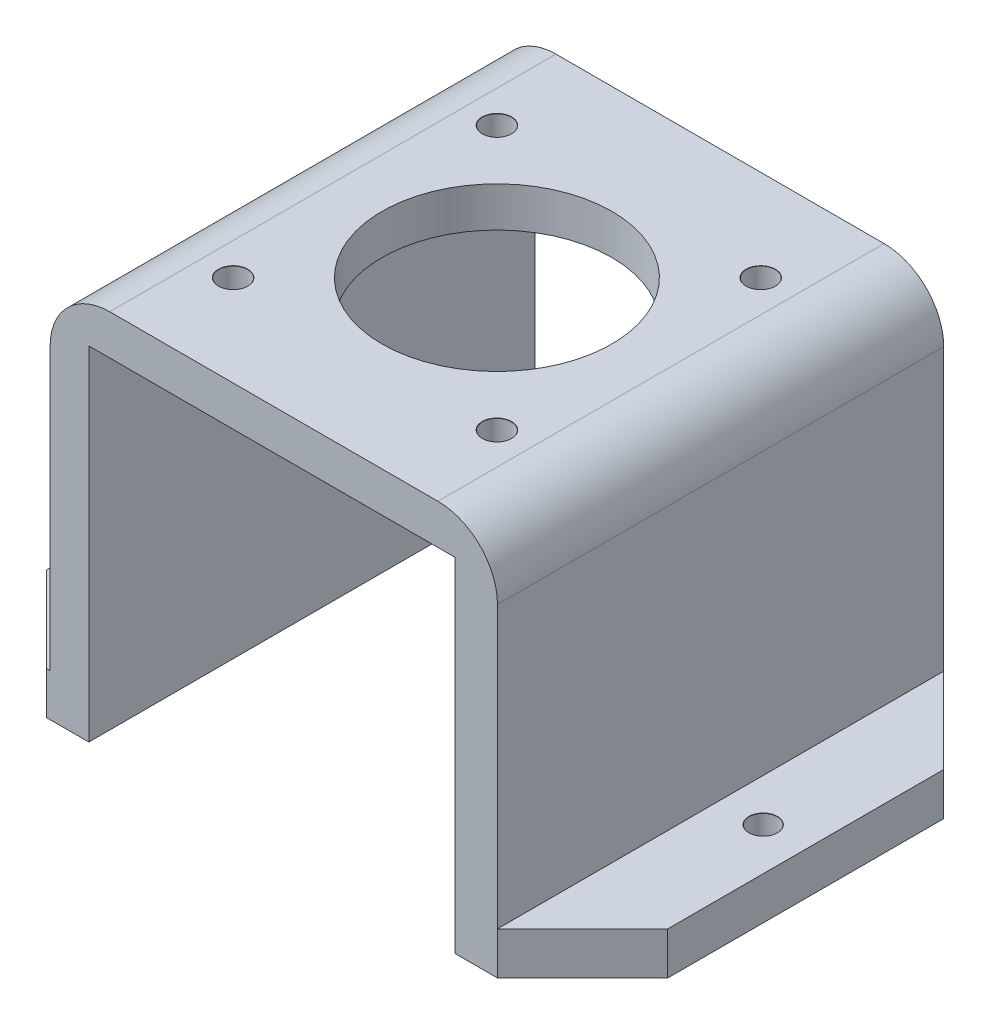
ISO-10303-21;
HEADER;
FILE_DESCRIPTION(('STEP AP214'),'2;1');
FILE_NAME('part.step','',(''),(''),'','','');
FILE_SCHEMA(('AUTOMOTIVE_DESIGN { 1 0 10303 214 1 1 1 1 }'));
ENDSEC;
DATA;
#1=APPLICATION_CONTEXT('core data for automotive mechanical design processes');
#2=APPLICATION_PROTOCOL_DEFINITION('international standard','automotive_design',2000,#1);
#3=PRODUCT_CONTEXT('',#1,'mechanical');
#4=PRODUCT('Part','Part','',(#3));
#5=PRODUCT_RELATED_PRODUCT_CATEGORY('part','',(#4));
#6=PRODUCT_DEFINITION_FORMATION('','',#4);
#7=PRODUCT_DEFINITION_CONTEXT('part definition',#1,'design');
#8=PRODUCT_DEFINITION('design','',#6,#7);
#9=PRODUCT_DEFINITION_SHAPE('','',#8);
#10=(LENGTH_UNIT() NAMED_UNIT(*) SI_UNIT(.MILLI.,.METRE.));
#11=(NAMED_UNIT(*) PLANE_ANGLE_UNIT() SI_UNIT($,.RADIAN.));
#12=(NAMED_UNIT(*) SI_UNIT($,.STERADIAN.) SOLID_ANGLE_UNIT());
#13=UNCERTAINTY_MEASURE_WITH_UNIT(LENGTH_MEASURE(1.E-05),#10,'distance_accuracy_value','');
#14=(GEOMETRIC_REPRESENTATION_CONTEXT(3) GLOBAL_UNCERTAINTY_ASSIGNED_CONTEXT((#13)) GLOBAL_UNIT_ASSIGNED_CONTEXT((#10,
#11,#12)) REPRESENTATION_CONTEXT('',''));
#15=CARTESIAN_POINT('',(0.,0.,0.));
#16=DIRECTION('',(0.,0.,1.));
#17=DIRECTION('',(1.,0.,0.));
#18=AXIS2_PLACEMENT_3D('',#15,#16,#17);
#19=CARTESIAN_POINT('',(15.,45.,0.));
#20=DIRECTION('',(-1.,0.,0.));
#21=DIRECTION('',(0.,0.,1.));
#22=AXIS2_PLACEMENT_3D('',#19,#20,#21);
#23=PLANE('',#22);
#24=DIRECTION('',(0.,0.,-1.));
#25=VECTOR('',#24,1.);
#26=CARTESIAN_POINT('',(15.,0.,0.));
#27=LINE('',#26,#25);
#28=CARTESIAN_POINT('',(15.,0.,-10.));
#29=VERTEX_POINT('',#28);
#30=CARTESIAN_POINT('',(15.,0.,-42.4179999999999));
#31=VERTEX_POINT('',#30);
#32=EDGE_CURVE('E232',#29,#31,#27,.T.);
#33=ORIENTED_EDGE('',*,*,#32,.T.);
#34=DIRECTION('',(0.,1.,0.));
#35=VECTOR('',#34,1.);
#36=CARTESIAN_POINT('',(15.,5.,-42.4179999999999));
#37=LINE('',#36,#35);
#38=CARTESIAN_POINT('',(15.,5.,-42.4179999999999));
#39=VERTEX_POINT('',#38);
#40=EDGE_CURVE('E292',#31,#39,#37,.T.);
#41=ORIENTED_EDGE('',*,*,#40,.T.);
#42=DIRECTION('',(0.,0.,1.));
#43=VECTOR('',#42,1.);
#44=CARTESIAN_POINT('',(15.,5.,0.));
#45=LINE('',#44,#43);
#46=CARTESIAN_POINT('',(15.,5.,-10.));
#47=VERTEX_POINT('',#46);
#48=EDGE_CURVE('E211',#39,#47,#45,.T.);
#49=ORIENTED_EDGE('',*,*,#48,.T.);
#50=DIRECTION('',(0.,-1.,0.));
#51=VECTOR('',#50,1.);
#52=CARTESIAN_POINT('',(15.,45.,-10.));
#53=LINE('',#52,#51);
#54=EDGE_CURVE('E289',#47,#29,#53,.T.);
#55=ORIENTED_EDGE('',*,*,#54,.T.);
#56=EDGE_LOOP('',(#33,#41,#49,#55));
#57=FACE_BOUND('',#56,.T.);
#58=ADVANCED_FACE('F40',(#57),#23,.F.);
#59=CARTESIAN_POINT('',(0.,45.,0.));
#60=DIRECTION('',(0.,0.,-1.));
#61=DIRECTION('',(-1.,0.,0.));
#62=AXIS2_PLACEMENT_3D('',#59,#60,#61);
#63=PLANE('',#62);
#64=DIRECTION('',(0.,1.,0.));
#65=VECTOR('',#64,1.);
#66=CARTESIAN_POINT('',(5.,5.,0.));
#67=LINE('',#66,#65);
#68=CARTESIAN_POINT('',(5.,5.,0.));
#69=VERTEX_POINT('',#68);
#70=CARTESIAN_POINT('',(5.,38.,0.));
#71=VERTEX_POINT('',#70);
#72=EDGE_CURVE('E218',#69,#71,#67,.T.);
#73=ORIENTED_EDGE('',*,*,#72,.T.);
#74=CARTESIAN_POINT('',(-2.,38.,0.));
#75=DIRECTION('',(0.,0.,-1.));
#76=DIRECTION('',(-1.,0.,0.));
#77=AXIS2_PLACEMENT_3D('',#74,#75,#76);
#78=CIRCLE('',#77,7.);
#79=CARTESIAN_POINT('',(-2.,45.,0.));
#80=VERTEX_POINT('',#79);
#81=EDGE_CURVE('E308',#71,#80,#78,.F.);
#82=ORIENTED_EDGE('',*,*,#81,.T.);
#83=DIRECTION('',(1.,0.,0.));
#84=VECTOR('',#83,1.);
#85=CARTESIAN_POINT('',(0.,45.,0.));
#86=LINE('',#85,#84);
#87=CARTESIAN_POINT('',(-40.5483696377772,45.,0.));
#88=VERTEX_POINT('',#87);
#89=EDGE_CURVE('E224',#88,#80,#86,.T.);
#90=ORIENTED_EDGE('',*,*,#89,.F.);
#91=CARTESIAN_POINT('',(-40.5483696377772,38.,0.));
#92=DIRECTION('',(0.,0.,-1.));
#93=DIRECTION('',(-1.,0.,0.));
#94=AXIS2_PLACEMENT_3D('',#91,#92,#93);
#95=CIRCLE('',#94,7.);
#96=CARTESIAN_POINT('',(-47.5483696377772,38.,0.));
#97=VERTEX_POINT('',#96);
#98=EDGE_CURVE('E306',#88,#97,#95,.F.);
#99=ORIENTED_EDGE('',*,*,#98,.T.);
#100=DIRECTION('',(0.,1.,0.));
#101=VECTOR('',#100,1.);
#102=CARTESIAN_POINT('',(-47.5483696377772,5.,0.));
#103=LINE('',#102,#101);
#104=CARTESIAN_POINT('',(-47.5483696377772,5.,0.));
#105=VERTEX_POINT('',#104);
#106=EDGE_CURVE('E166',#105,#97,#103,.T.);
#107=ORIENTED_EDGE('',*,*,#106,.F.);
#108=DIRECTION('',(1.,0.,0.));
#109=VECTOR('',#108,1.);
#110=CARTESIAN_POINT('',(0.,5.,0.));
#111=LINE('',#110,#109);
#112=CARTESIAN_POINT('',(-48.,5.,0.));
#113=VERTEX_POINT('',#112);
#114=EDGE_CURVE('E167',#113,#105,#111,.T.);
#115=ORIENTED_EDGE('',*,*,#114,.F.);
#116=DIRECTION('',(0.,-1.,0.));
#117=VECTOR('',#116,1.);
#118=CARTESIAN_POINT('',(-48.,45.,0.));
#119=LINE('',#118,#117);
#120=CARTESIAN_POINT('',(-48.,0.,0.));
#121=VERTEX_POINT('',#120);
#122=EDGE_CURVE('E298',#113,#121,#119,.T.);
#123=ORIENTED_EDGE('',*,*,#122,.T.);
#124=DIRECTION('',(-1.,0.,0.));
#125=VECTOR('',#124,1.);
#126=CARTESIAN_POINT('',(-43.,0.,0.));
#127=LINE('',#126,#125);
#128=CARTESIAN_POINT('',(-43.,0.,0.));
#129=VERTEX_POINT('',#128);
#130=EDGE_CURVE('E201',#129,#121,#127,.T.);
#131=ORIENTED_EDGE('',*,*,#130,.F.);
#132=DIRECTION('',(0.,-1.,0.));
#133=VECTOR('',#132,1.);
#134=CARTESIAN_POINT('',(-43.,45.,0.));
#135=LINE('',#134,#133);
#136=CARTESIAN_POINT('',(-43.,40.3,0.));
#137=VERTEX_POINT('',#136);
#138=EDGE_CURVE('E188',#137,#129,#135,.T.);
#139=ORIENTED_EDGE('',*,*,#138,.F.);
#140=DIRECTION('',(1.,0.,0.));
#141=VECTOR('',#140,1.);
#142=CARTESIAN_POINT('',(-44.,40.3,0.));
#143=LINE('',#142,#141);
#144=CARTESIAN_POINT('',(0.,40.3,0.));
#145=VERTEX_POINT('',#144);
#146=EDGE_CURVE('E207',#137,#145,#143,.T.);
#147=ORIENTED_EDGE('',*,*,#146,.T.);
#148=DIRECTION('',(0.,-1.,0.));
#149=VECTOR('',#148,1.);
#150=CARTESIAN_POINT('',(0.,45.,0.));
#151=LINE('',#150,#149);
#152=CARTESIAN_POINT('',(0.,0.,0.));
#153=VERTEX_POINT('',#152);
#154=EDGE_CURVE('E229',#145,#153,#151,.T.);
#155=ORIENTED_EDGE('',*,*,#154,.T.);
#156=DIRECTION('',(1.,0.,0.));
#157=VECTOR('',#156,1.);
#158=CARTESIAN_POINT('',(0.,0.,0.));
#159=LINE('',#158,#157);
#160=CARTESIAN_POINT('',(4.99999999999997,0.,0.));
#161=VERTEX_POINT('',#160);
#162=EDGE_CURVE('E221',#153,#161,#159,.T.);
#163=ORIENTED_EDGE('',*,*,#162,.T.);
#164=DIRECTION('',(0.,1.,0.));
#165=VECTOR('',#164,1.);
#166=CARTESIAN_POINT('',(4.99999999999997,45.,0.));
#167=LINE('',#166,#165);
#168=EDGE_CURVE('E301',#161,#69,#167,.T.);
#169=ORIENTED_EDGE('',*,*,#168,.T.);
#170=EDGE_LOOP('',(#73,#82,#90,#99,#107,#115,#123,#131,#139,#147,#155,#163,#169));
#171=FACE_BOUND('',#170,.T.);
#172=ADVANCED_FACE('F327',(#171),#63,.F.);
#173=CARTESIAN_POINT('',(0.,45.,-52.418));
#174=DIRECTION('',(0.,0.,-1.));
#175=DIRECTION('',(-1.,0.,0.));
#176=AXIS2_PLACEMENT_3D('',#173,#174,#175);
#177=PLANE('',#176);
#178=DIRECTION('',(1.,0.,0.));
#179=VECTOR('',#178,1.);
#180=CARTESIAN_POINT('',(0.,45.,-52.418));
#181=LINE('',#180,#179);
#182=CARTESIAN_POINT('',(-40.5483696377772,45.,-52.418));
#183=VERTEX_POINT('',#182);
#184=CARTESIAN_POINT('',(-2.,45.,-52.418));
#185=VERTEX_POINT('',#184);
#186=EDGE_CURVE('E226',#183,#185,#181,.T.);
#187=ORIENTED_EDGE('',*,*,#186,.T.);
#188=CARTESIAN_POINT('',(-2.,38.,-52.418));
#189=DIRECTION('',(0.,0.,-1.));
#190=DIRECTION('',(-1.,0.,0.));
#191=AXIS2_PLACEMENT_3D('',#188,#189,#190);
#192=CIRCLE('',#191,7.);
#193=CARTESIAN_POINT('',(5.,38.,-52.418));
#194=VERTEX_POINT('',#193);
#195=EDGE_CURVE('E48',#185,#194,#192,.T.);
#196=ORIENTED_EDGE('',*,*,#195,.T.);
#197=DIRECTION('',(0.,1.,0.));
#198=VECTOR('',#197,1.);
#199=CARTESIAN_POINT('',(5.,5.,-52.418));
#200=LINE('',#199,#198);
#201=CARTESIAN_POINT('',(5.,5.,-52.418));
#202=VERTEX_POINT('',#201);
#203=EDGE_CURVE('E217',#202,#194,#200,.T.);
#204=ORIENTED_EDGE('',*,*,#203,.F.);
#205=DIRECTION('',(0.,-1.,0.));
#206=VECTOR('',#205,1.);
#207=CARTESIAN_POINT('',(4.99999999999999,0.,-52.418));
#208=LINE('',#207,#206);
#209=CARTESIAN_POINT('',(4.99999999999999,0.,-52.418));
#210=VERTEX_POINT('',#209);
#211=EDGE_CURVE('E277',#202,#210,#208,.T.);
#212=ORIENTED_EDGE('',*,*,#211,.T.);
#213=DIRECTION('',(1.,0.,0.));
#214=VECTOR('',#213,1.);
#215=CARTESIAN_POINT('',(0.,0.,-52.418));
#216=LINE('',#215,#214);
#217=CARTESIAN_POINT('',(0.,0.,-52.418));
#218=VERTEX_POINT('',#217);
#219=EDGE_CURVE('E235',#218,#210,#216,.T.);
#220=ORIENTED_EDGE('',*,*,#219,.F.);
#221=DIRECTION('',(0.,-1.,0.));
#222=VECTOR('',#221,1.);
#223=CARTESIAN_POINT('',(0.,45.,-52.418));
#224=LINE('',#223,#222);
#225=CARTESIAN_POINT('',(0.,40.3,-52.418));
#226=VERTEX_POINT('',#225);
#227=EDGE_CURVE('E241',#226,#218,#224,.T.);
#228=ORIENTED_EDGE('',*,*,#227,.F.);
#229=DIRECTION('',(1.,0.,0.));
#230=VECTOR('',#229,1.);
#231=CARTESIAN_POINT('',(-44.,40.3,-52.418));
#232=LINE('',#231,#230);
#233=CARTESIAN_POINT('',(-43.,40.3,-52.418));
#234=VERTEX_POINT('',#233);
#235=EDGE_CURVE('E209',#234,#226,#232,.T.);
#236=ORIENTED_EDGE('',*,*,#235,.F.);
#237=DIRECTION('',(0.,-1.,0.));
#238=VECTOR('',#237,1.);
#239=CARTESIAN_POINT('',(-43.,45.,-52.418));
#240=LINE('',#239,#238);
#241=CARTESIAN_POINT('',(-43.,0.,-52.418));
#242=VERTEX_POINT('',#241);
#243=EDGE_CURVE('E190',#234,#242,#240,.T.);
#244=ORIENTED_EDGE('',*,*,#243,.T.);
#245=DIRECTION('',(-1.,0.,0.));
#246=VECTOR('',#245,1.);
#247=CARTESIAN_POINT('',(-43.,0.,-52.418));
#248=LINE('',#247,#246);
#249=CARTESIAN_POINT('',(-48.,0.,-52.418));
#250=VERTEX_POINT('',#249);
#251=EDGE_CURVE('E196',#242,#250,#248,.T.);
#252=ORIENTED_EDGE('',*,*,#251,.T.);
#253=DIRECTION('',(0.,1.,0.));
#254=VECTOR('',#253,1.);
#255=CARTESIAN_POINT('',(-48.,5.,-52.418));
#256=LINE('',#255,#254);
#257=CARTESIAN_POINT('',(-48.,5.,-52.418));
#258=VERTEX_POINT('',#257);
#259=EDGE_CURVE('E180',#250,#258,#256,.T.);
#260=ORIENTED_EDGE('',*,*,#259,.T.);
#261=DIRECTION('',(-1.,0.,0.));
#262=VECTOR('',#261,1.);
#263=CARTESIAN_POINT('',(0.,5.,-52.418));
#264=LINE('',#263,#262);
#265=CARTESIAN_POINT('',(-47.5483696377772,5.,-52.418));
#266=VERTEX_POINT('',#265);
#267=EDGE_CURVE('E172',#266,#258,#264,.T.);
#268=ORIENTED_EDGE('',*,*,#267,.F.);
#269=DIRECTION('',(0.,1.,0.));
#270=VECTOR('',#269,1.);
#271=CARTESIAN_POINT('',(-47.5483696377772,5.,-52.418));
#272=LINE('',#271,#270);
#273=CARTESIAN_POINT('',(-47.5483696377772,38.,-52.418));
#274=VERTEX_POINT('',#273);
#275=EDGE_CURVE('E158',#266,#274,#272,.T.);
#276=ORIENTED_EDGE('',*,*,#275,.T.);
#277=CARTESIAN_POINT('',(-40.5483696377772,38.,-52.418));
#278=DIRECTION('',(0.,0.,-1.));
#279=DIRECTION('',(-1.,0.,0.));
#280=AXIS2_PLACEMENT_3D('',#277,#278,#279);
#281=CIRCLE('',#280,7.);
#282=EDGE_CURVE('E314',#274,#183,#281,.T.);
#283=ORIENTED_EDGE('',*,*,#282,.T.);
#284=EDGE_LOOP('',(#187,#196,#204,#212,#220,#228,#236,#244,#252,#260,#268,#276,#283));
#285=FACE_BOUND('',#284,.T.);
#286=ADVANCED_FACE('F177',(#285),#177,.T.);
#287=CARTESIAN_POINT('',(0.,45.,0.));
#288=DIRECTION('',(-1.,0.,0.));
#289=DIRECTION('',(0.,0.,1.));
#290=AXIS2_PLACEMENT_3D('',#287,#288,#289);
#291=PLANE('',#290);
#292=DIRECTION('',(0.,0.,1.));
#293=VECTOR('',#292,1.);
#294=CARTESIAN_POINT('',(0.,40.3,0.));
#295=LINE('',#294,#293);
#296=EDGE_CURVE('E204',#226,#145,#295,.T.);
#297=ORIENTED_EDGE('',*,*,#296,.F.);
#298=ORIENTED_EDGE('',*,*,#227,.T.);
#299=DIRECTION('',(0.,0.,-1.));
#300=VECTOR('',#299,1.);
#301=CARTESIAN_POINT('',(0.,0.,0.));
#302=LINE('',#301,#300);
#303=EDGE_CURVE('E227',#153,#218,#302,.T.);
#304=ORIENTED_EDGE('',*,*,#303,.F.);
#305=ORIENTED_EDGE('',*,*,#154,.F.);
#306=EDGE_LOOP('',(#297,#298,#304,#305));
#307=FACE_BOUND('',#306,.T.);
#308=ADVANCED_FACE('F361',(#307),#291,.T.);
#309=CARTESIAN_POINT('',(0.,45.,0.));
#310=DIRECTION('',(0.,1.,0.));
#311=DIRECTION('',(0.,0.,1.));
#312=AXIS2_PLACEMENT_3D('',#309,#310,#311);
#313=PLANE('',#312);
#314=CARTESIAN_POINT('',(-21.2741848188886,45.,-26.209));
#315=DIRECTION('',(0.,1.,0.));
#316=DIRECTION('',(0.,0.,1.));
#317=AXIS2_PLACEMENT_3D('',#314,#315,#316);
#318=CIRCLE('',#317,13.5);
#319=CARTESIAN_POINT('',(-21.2741848188886,45.,-12.709));
#320=VERTEX_POINT('',#319);
#321=EDGE_CURVE('E268',#320,#320,#318,.T.);
#322=ORIENTED_EDGE('',*,*,#321,.F.);
#323=EDGE_LOOP('',(#322));
#324=FACE_BOUND('',#323,.T.);
#325=CARTESIAN_POINT('',(-36.7681848188886,45.,-41.703));
#326=DIRECTION('',(0.,1.,0.));
#327=DIRECTION('',(0.,0.,1.));
#328=AXIS2_PLACEMENT_3D('',#325,#326,#327);
#329=CIRCLE('',#328,1.725);
#330=CARTESIAN_POINT('',(-36.7681848188886,45.,-39.978));
#331=VERTEX_POINT('',#330);
#332=EDGE_CURVE('E267',#331,#331,#329,.T.);
#333=ORIENTED_EDGE('',*,*,#332,.F.);
#334=EDGE_LOOP('',(#333));
#335=FACE_BOUND('',#334,.T.);
#336=CARTESIAN_POINT('',(-5.78018481888859,45.,-41.703));
#337=DIRECTION('',(0.,1.,0.));
#338=DIRECTION('',(0.,0.,1.));
#339=AXIS2_PLACEMENT_3D('',#336,#337,#338);
#340=CIRCLE('',#339,1.725);
#341=CARTESIAN_POINT('',(-5.78018481888859,45.,-39.978));
#342=VERTEX_POINT('',#341);
#343=EDGE_CURVE('E262',#342,#342,#340,.T.);
#344=ORIENTED_EDGE('',*,*,#343,.F.);
#345=EDGE_LOOP('',(#344));
#346=FACE_BOUND('',#345,.T.);
#347=CARTESIAN_POINT('',(-5.78018481888859,45.,-10.715));
#348=DIRECTION('',(0.,1.,0.));
#349=DIRECTION('',(0.,0.,1.));
#350=AXIS2_PLACEMENT_3D('',#347,#348,#349);
#351=CIRCLE('',#350,1.725);
#352=CARTESIAN_POINT('',(-5.78018481888859,45.,-8.99));
#353=VERTEX_POINT('',#352);
#354=EDGE_CURVE('E257',#353,#353,#351,.T.);
#355=ORIENTED_EDGE('',*,*,#354,.F.);
#356=EDGE_LOOP('',(#355));
#357=FACE_BOUND('',#356,.T.);
#358=CARTESIAN_POINT('',(-36.7681848188886,45.,-10.715));
#359=DIRECTION('',(0.,1.,0.));
#360=DIRECTION('',(0.,0.,1.));
#361=AXIS2_PLACEMENT_3D('',#358,#359,#360);
#362=CIRCLE('',#361,1.725);
#363=CARTESIAN_POINT('',(-36.7681848188886,45.,-8.99));
#364=VERTEX_POINT('',#363);
#365=EDGE_CURVE('E252',#364,#364,#362,.T.);
#366=ORIENTED_EDGE('',*,*,#365,.F.);
#367=EDGE_LOOP('',(#366));
#368=FACE_BOUND('',#367,.T.);
#369=ORIENTED_EDGE('',*,*,#89,.T.);
#370=DIRECTION('',(0.,0.,1.));
#371=VECTOR('',#370,1.);
#372=CARTESIAN_POINT('',(-2.,45.,-52.418));
#373=LINE('',#372,#371);
#374=EDGE_CURVE('E61',#80,#185,#373,.F.);
#375=ORIENTED_EDGE('',*,*,#374,.T.);
#376=ORIENTED_EDGE('',*,*,#186,.F.);
#377=DIRECTION('',(0.,0.,1.));
#378=VECTOR('',#377,1.);
#379=CARTESIAN_POINT('',(-40.5483696377772,45.,0.));
#380=LINE('',#379,#378);
#381=EDGE_CURVE('E310',#183,#88,#380,.T.);
#382=ORIENTED_EDGE('',*,*,#381,.T.);
#383=EDGE_LOOP('',(#369,#375,#376,#382));
#384=FACE_BOUND('',#383,.T.);
#385=ADVANCED_FACE('F328',(#324,#335,#346,#357,#368,#384),#313,.T.);
#386=CARTESIAN_POINT('',(0.,0.,0.));
#387=DIRECTION('',(0.,1.,0.));
#388=DIRECTION('',(0.,0.,1.));
#389=AXIS2_PLACEMENT_3D('',#386,#387,#388);
#390=PLANE('',#389);
#391=CARTESIAN_POINT('',(9.99999999999999,0.,-26.209));
#392=DIRECTION('',(0.,1.,0.));
#393=DIRECTION('',(0.,0.,1.));
#394=AXIS2_PLACEMENT_3D('',#391,#392,#393);
#395=CIRCLE('',#394,1.65);
#396=CARTESIAN_POINT('',(9.99999999999999,0.,-24.559));
#397=VERTEX_POINT('',#396);
#398=EDGE_CURVE('E729',#397,#397,#395,.T.);
#399=ORIENTED_EDGE('',*,*,#398,.T.);
#400=EDGE_LOOP('',(#399));
#401=FACE_BOUND('',#400,.T.);
#402=ORIENTED_EDGE('',*,*,#219,.T.);
#403=DIRECTION('',(0.707106781186546,0.,0.707106781186549));
#404=VECTOR('',#403,1.);
#405=CARTESIAN_POINT('',(4.99999999999999,0.,-52.418));
#406=LINE('',#405,#404);
#407=EDGE_CURVE('E287',#210,#31,#406,.T.);
#408=ORIENTED_EDGE('',*,*,#407,.T.);
#409=ORIENTED_EDGE('',*,*,#32,.F.);
#410=DIRECTION('',(0.707106781186549,0.,-0.707106781186546));
#411=VECTOR('',#410,1.);
#412=CARTESIAN_POINT('',(15.,0.,-10.));
#413=LINE('',#412,#411);
#414=EDGE_CURVE('E285',#29,#161,#413,.F.);
#415=ORIENTED_EDGE('',*,*,#414,.T.);
#416=ORIENTED_EDGE('',*,*,#162,.F.);
#417=ORIENTED_EDGE('',*,*,#303,.T.);
#418=EDGE_LOOP('',(#402,#408,#409,#415,#416,#417));
#419=FACE_BOUND('',#418,.T.);
#420=ADVANCED_FACE('F442',(#401,#419),#390,.F.);
#421=CARTESIAN_POINT('',(5.,5.,0.));
#422=DIRECTION('',(-1.,0.,0.));
#423=DIRECTION('',(0.,0.,1.));
#424=AXIS2_PLACEMENT_3D('',#421,#422,#423);
#425=PLANE('',#424);
#426=ORIENTED_EDGE('',*,*,#203,.T.);
#427=DIRECTION('',(0.,0.,1.));
#428=VECTOR('',#427,1.);
#429=CARTESIAN_POINT('',(5.,38.,0.));
#430=LINE('',#429,#428);
#431=EDGE_CURVE('E303',#194,#71,#430,.T.);
#432=ORIENTED_EDGE('',*,*,#431,.T.);
#433=ORIENTED_EDGE('',*,*,#72,.F.);
#434=DIRECTION('',(0.,0.,1.));
#435=VECTOR('',#434,1.);
#436=CARTESIAN_POINT('',(5.,5.,0.));
#437=LINE('',#436,#435);
#438=EDGE_CURVE('E214',#202,#69,#437,.T.);
#439=ORIENTED_EDGE('',*,*,#438,.F.);
#440=EDGE_LOOP('',(#426,#432,#433,#439));
#441=FACE_BOUND('',#440,.T.);
#442=ADVANCED_FACE('F322',(#441),#425,.F.);
#443=CARTESIAN_POINT('',(0.,5.,0.));
#444=DIRECTION('',(0.,1.,0.));
#445=DIRECTION('',(0.,0.,1.));
#446=AXIS2_PLACEMENT_3D('',#443,#444,#445);
#447=PLANE('',#446);
#448=CARTESIAN_POINT('',(9.99999999999999,5.,-26.209));
#449=DIRECTION('',(0.,1.,0.));
#450=DIRECTION('',(0.,0.,1.));
#451=AXIS2_PLACEMENT_3D('',#448,#449,#450);
#452=CIRCLE('',#451,1.675);
#453=CARTESIAN_POINT('',(9.99999999999999,5.,-24.534));
#454=VERTEX_POINT('',#453);
#455=EDGE_CURVE('E735',#454,#454,#452,.T.);
#456=ORIENTED_EDGE('',*,*,#455,.F.);
#457=EDGE_LOOP('',(#456));
#458=FACE_BOUND('',#457,.T.);
#459=ORIENTED_EDGE('',*,*,#48,.F.);
#460=DIRECTION('',(-0.707106781186546,0.,-0.707106781186549));
#461=VECTOR('',#460,1.);
#462=CARTESIAN_POINT('',(28.709,5.,-28.7089999999999));
#463=LINE('',#462,#461);
#464=EDGE_CURVE('E296',#39,#202,#463,.T.);
#465=ORIENTED_EDGE('',*,*,#464,.T.);
#466=ORIENTED_EDGE('',*,*,#438,.T.);
#467=DIRECTION('',(-0.707106781186549,0.,0.707106781186546));
#468=VECTOR('',#467,1.);
#469=CARTESIAN_POINT('',(2.49999999999998,5.,2.49999999999998));
#470=LINE('',#469,#468);
#471=EDGE_CURVE('E294',#69,#47,#470,.F.);
#472=ORIENTED_EDGE('',*,*,#471,.T.);
#473=EDGE_LOOP('',(#459,#465,#466,#472));
#474=FACE_BOUND('',#473,.T.);
#475=ADVANCED_FACE('F364',(#458,#474),#447,.T.);
#476=CARTESIAN_POINT('',(-44.,40.3,0.));
#477=DIRECTION('',(0.,1.,0.));
#478=DIRECTION('',(0.,0.,1.));
#479=AXIS2_PLACEMENT_3D('',#476,#477,#478);
#480=PLANE('',#479);
#481=CARTESIAN_POINT('',(-21.2741848188886,40.3,-26.209));
#482=DIRECTION('',(0.,1.,0.));
#483=DIRECTION('',(0.,0.,1.));
#484=AXIS2_PLACEMENT_3D('',#481,#482,#483);
#485=CIRCLE('',#484,13.5);
#486=CARTESIAN_POINT('',(-21.2741848188886,40.3,-12.709));
#487=VERTEX_POINT('',#486);
#488=EDGE_CURVE('E264',#487,#487,#485,.T.);
#489=ORIENTED_EDGE('',*,*,#488,.T.);
#490=EDGE_LOOP('',(#489));
#491=FACE_BOUND('',#490,.T.);
#492=CARTESIAN_POINT('',(-36.7681848188886,40.3,-41.703));
#493=DIRECTION('',(0.,1.,0.));
#494=DIRECTION('',(0.,0.,1.));
#495=AXIS2_PLACEMENT_3D('',#492,#493,#494);
#496=CIRCLE('',#495,1.7);
#497=CARTESIAN_POINT('',(-36.7681848188886,40.3,-40.003));
#498=VERTEX_POINT('',#497);
#499=EDGE_CURVE('E259',#498,#498,#496,.T.);
#500=ORIENTED_EDGE('',*,*,#499,.T.);
#501=EDGE_LOOP('',(#500));
#502=FACE_BOUND('',#501,.T.);
#503=CARTESIAN_POINT('',(-5.78018481888859,40.3,-41.703));
#504=DIRECTION('',(0.,1.,0.));
#505=DIRECTION('',(0.,0.,1.));
#506=AXIS2_PLACEMENT_3D('',#503,#504,#505);
#507=CIRCLE('',#506,1.7);
#508=CARTESIAN_POINT('',(-5.78018481888859,40.3,-40.003));
#509=VERTEX_POINT('',#508);
#510=EDGE_CURVE('E254',#509,#509,#507,.T.);
#511=ORIENTED_EDGE('',*,*,#510,.T.);
#512=EDGE_LOOP('',(#511));
#513=FACE_BOUND('',#512,.T.);
#514=CARTESIAN_POINT('',(-5.78018481888859,40.3,-10.715));
#515=DIRECTION('',(0.,1.,0.));
#516=DIRECTION('',(0.,0.,1.));
#517=AXIS2_PLACEMENT_3D('',#514,#515,#516);
#518=CIRCLE('',#517,1.7);
#519=CARTESIAN_POINT('',(-5.78018481888859,40.3,-9.015));
#520=VERTEX_POINT('',#519);
#521=EDGE_CURVE('E249',#520,#520,#518,.T.);
#522=ORIENTED_EDGE('',*,*,#521,.T.);
#523=EDGE_LOOP('',(#522));
#524=FACE_BOUND('',#523,.T.);
#525=CARTESIAN_POINT('',(-36.7681848188886,40.3,-10.715));
#526=DIRECTION('',(0.,1.,0.));
#527=DIRECTION('',(0.,0.,1.));
#528=AXIS2_PLACEMENT_3D('',#525,#526,#527);
#529=CIRCLE('',#528,1.7);
#530=CARTESIAN_POINT('',(-36.7681848188886,40.3,-9.015));
#531=VERTEX_POINT('',#530);
#532=EDGE_CURVE('E175',#531,#531,#529,.T.);
#533=ORIENTED_EDGE('',*,*,#532,.T.);
#534=EDGE_LOOP('',(#533));
#535=FACE_BOUND('',#534,.T.);
#536=ORIENTED_EDGE('',*,*,#146,.F.);
#537=DIRECTION('',(0.,0.,-1.));
#538=VECTOR('',#537,1.);
#539=CARTESIAN_POINT('',(-43.,40.3,0.));
#540=LINE('',#539,#538);
#541=EDGE_CURVE('E243',#137,#234,#540,.T.);
#542=ORIENTED_EDGE('',*,*,#541,.T.);
#543=ORIENTED_EDGE('',*,*,#235,.T.);
#544=ORIENTED_EDGE('',*,*,#296,.T.);
#545=EDGE_LOOP('',(#536,#542,#543,#544));
#546=FACE_BOUND('',#545,.T.);
#547=ADVANCED_FACE('F362',(#491,#502,#513,#524,#535,#546),#480,.F.);
#548=CARTESIAN_POINT('',(-43.,45.,-52.418));
#549=DIRECTION('',(1.,0.,0.));
#550=DIRECTION('',(0.,0.,-1.));
#551=AXIS2_PLACEMENT_3D('',#548,#549,#550);
#552=PLANE('',#551);
#553=ORIENTED_EDGE('',*,*,#541,.F.);
#554=ORIENTED_EDGE('',*,*,#138,.T.);
#555=DIRECTION('',(0.,0.,1.));
#556=VECTOR('',#555,1.);
#557=CARTESIAN_POINT('',(-43.,0.,-52.418));
#558=LINE('',#557,#556);
#559=EDGE_CURVE('E192',#242,#129,#558,.T.);
#560=ORIENTED_EDGE('',*,*,#559,.F.);
#561=ORIENTED_EDGE('',*,*,#243,.F.);
#562=EDGE_LOOP('',(#553,#554,#560,#561));
#563=FACE_BOUND('',#562,.T.);
#564=ADVANCED_FACE('F353',(#563),#552,.T.);
#565=CARTESIAN_POINT('',(-58.,45.,-52.418));
#566=DIRECTION('',(1.,0.,0.));
#567=DIRECTION('',(0.,0.,-1.));
#568=AXIS2_PLACEMENT_3D('',#565,#566,#567);
#569=PLANE('',#568);
#570=DIRECTION('',(0.,0.,1.));
#571=VECTOR('',#570,1.);
#572=CARTESIAN_POINT('',(-58.,5.,0.));
#573=LINE('',#572,#571);
#574=CARTESIAN_POINT('',(-58.,5.,-42.418));
#575=VERTEX_POINT('',#574);
#576=CARTESIAN_POINT('',(-58.,5.,-10.));
#577=VERTEX_POINT('',#576);
#578=EDGE_CURVE('E181',#575,#577,#573,.T.);
#579=ORIENTED_EDGE('',*,*,#578,.F.);
#580=DIRECTION('',(0.,-1.,0.));
#581=VECTOR('',#580,1.);
#582=CARTESIAN_POINT('',(-58.,0.,-42.418));
#583=LINE('',#582,#581);
#584=CARTESIAN_POINT('',(-58.,0.,-42.418));
#585=VERTEX_POINT('',#584);
#586=EDGE_CURVE('E270',#575,#585,#583,.T.);
#587=ORIENTED_EDGE('',*,*,#586,.T.);
#588=DIRECTION('',(0.,0.,1.));
#589=VECTOR('',#588,1.);
#590=CARTESIAN_POINT('',(-58.,0.,-52.418));
#591=LINE('',#590,#589);
#592=CARTESIAN_POINT('',(-58.,0.,-10.));
#593=VERTEX_POINT('',#592);
#594=EDGE_CURVE('E198',#585,#593,#591,.T.);
#595=ORIENTED_EDGE('',*,*,#594,.T.);
#596=DIRECTION('',(0.,1.,0.));
#597=VECTOR('',#596,1.);
#598=CARTESIAN_POINT('',(-58.,45.,-10.));
#599=LINE('',#598,#597);
#600=EDGE_CURVE('E245',#593,#577,#599,.T.);
#601=ORIENTED_EDGE('',*,*,#600,.T.);
#602=EDGE_LOOP('',(#579,#587,#595,#601));
#603=FACE_BOUND('',#602,.T.);
#604=ADVANCED_FACE('F342',(#603),#569,.F.);
#605=CARTESIAN_POINT('',(0.,0.,0.));
#606=DIRECTION('',(0.,1.,0.));
#607=DIRECTION('',(0.,0.,1.));
#608=AXIS2_PLACEMENT_3D('',#605,#606,#607);
#609=PLANE('',#608);
#610=CARTESIAN_POINT('',(-52.7741848188886,0.,-26.209));
#611=DIRECTION('',(0.,1.,0.));
#612=DIRECTION('',(0.,0.,1.));
#613=AXIS2_PLACEMENT_3D('',#610,#611,#612);
#614=CIRCLE('',#613,1.65);
#615=CARTESIAN_POINT('',(-52.7741848188886,0.,-24.559));
#616=VERTEX_POINT('',#615);
#617=EDGE_CURVE('E738',#616,#616,#614,.T.);
#618=ORIENTED_EDGE('',*,*,#617,.T.);
#619=EDGE_LOOP('',(#618));
#620=FACE_BOUND('',#619,.T.);
#621=ORIENTED_EDGE('',*,*,#594,.F.);
#622=DIRECTION('',(0.707106781186549,0.,-0.707106781186546));
#623=VECTOR('',#622,1.);
#624=CARTESIAN_POINT('',(-58.,0.,-42.418));
#625=LINE('',#624,#623);
#626=EDGE_CURVE('E275',#585,#250,#625,.T.);
#627=ORIENTED_EDGE('',*,*,#626,.T.);
#628=ORIENTED_EDGE('',*,*,#251,.F.);
#629=ORIENTED_EDGE('',*,*,#559,.T.);
#630=ORIENTED_EDGE('',*,*,#130,.T.);
#631=DIRECTION('',(0.707106781186546,0.,0.707106781186549));
#632=VECTOR('',#631,1.);
#633=CARTESIAN_POINT('',(-48.,0.,0.));
#634=LINE('',#633,#632);
#635=EDGE_CURVE('E273',#121,#593,#634,.F.);
#636=ORIENTED_EDGE('',*,*,#635,.T.);
#637=EDGE_LOOP('',(#621,#627,#628,#629,#630,#636));
#638=FACE_BOUND('',#637,.T.);
#639=ADVANCED_FACE('F339',(#620,#638),#609,.F.);
#640=CARTESIAN_POINT('',(-47.5483696377772,5.,0.));
#641=DIRECTION('',(-1.,0.,0.));
#642=DIRECTION('',(0.,0.,1.));
#643=AXIS2_PLACEMENT_3D('',#640,#641,#642);
#644=PLANE('',#643);
#645=ORIENTED_EDGE('',*,*,#106,.T.);
#646=DIRECTION('',(0.,0.,1.));
#647=VECTOR('',#646,1.);
#648=CARTESIAN_POINT('',(-47.5483696377772,38.,0.));
#649=LINE('',#648,#647);
#650=EDGE_CURVE('E11',#97,#274,#649,.F.);
#651=ORIENTED_EDGE('',*,*,#650,.T.);
#652=ORIENTED_EDGE('',*,*,#275,.F.);
#653=DIRECTION('',(0.,0.,1.));
#654=VECTOR('',#653,1.);
#655=CARTESIAN_POINT('',(-47.5483696377772,5.,0.));
#656=LINE('',#655,#654);
#657=EDGE_CURVE('E161',#266,#105,#656,.T.);
#658=ORIENTED_EDGE('',*,*,#657,.T.);
#659=EDGE_LOOP('',(#645,#651,#652,#658));
#660=FACE_BOUND('',#659,.T.);
#661=ADVANCED_FACE('F160',(#660),#644,.T.);
#662=CARTESIAN_POINT('',(0.,5.,0.));
#663=DIRECTION('',(0.,1.,0.));
#664=DIRECTION('',(0.,0.,1.));
#665=AXIS2_PLACEMENT_3D('',#662,#663,#664);
#666=PLANE('',#665);
#667=CARTESIAN_POINT('',(-52.7741848188886,5.,-26.209));
#668=DIRECTION('',(0.,1.,0.));
#669=DIRECTION('',(0.,0.,1.));
#670=AXIS2_PLACEMENT_3D('',#667,#668,#669);
#671=CIRCLE('',#670,1.675);
#672=CARTESIAN_POINT('',(-52.7741848188886,5.,-24.534));
#673=VERTEX_POINT('',#672);
#674=EDGE_CURVE('E744',#673,#673,#671,.T.);
#675=ORIENTED_EDGE('',*,*,#674,.F.);
#676=EDGE_LOOP('',(#675));
#677=FACE_BOUND('',#676,.T.);
#678=ORIENTED_EDGE('',*,*,#267,.T.);
#679=DIRECTION('',(-0.707106781186549,0.,0.707106781186546));
#680=VECTOR('',#679,1.);
#681=CARTESIAN_POINT('',(-50.2089999999999,5.,-50.2090000000001));
#682=LINE('',#681,#680);
#683=EDGE_CURVE('E283',#258,#575,#682,.T.);
#684=ORIENTED_EDGE('',*,*,#683,.T.);
#685=ORIENTED_EDGE('',*,*,#578,.T.);
#686=DIRECTION('',(-0.707106781186546,0.,-0.707106781186549));
#687=VECTOR('',#686,1.);
#688=CARTESIAN_POINT('',(-24.0000000000001,5.,24.));
#689=LINE('',#688,#687);
#690=EDGE_CURVE('E281',#577,#113,#689,.F.);
#691=ORIENTED_EDGE('',*,*,#690,.T.);
#692=ORIENTED_EDGE('',*,*,#114,.T.);
#693=ORIENTED_EDGE('',*,*,#657,.F.);
#694=EDGE_LOOP('',(#678,#684,#685,#691,#692,#693));
#695=FACE_BOUND('',#694,.T.);
#696=ADVANCED_FACE('F171',(#677,#695),#666,.T.);
#697=CARTESIAN_POINT('',(-36.7681848188886,45.,-10.715));
#698=DIRECTION('',(0.,1.,0.));
#699=DIRECTION('',(0.,0.,1.));
#700=AXIS2_PLACEMENT_3D('',#697,#698,#699);
#701=CYLINDRICAL_SURFACE('',#700,1.7);
#702=CARTESIAN_POINT('',(-36.7681848188886,44.975,-10.715));
#703=DIRECTION('',(0.,1.,0.));
#704=DIRECTION('',(0.,0.,1.));
#705=AXIS2_PLACEMENT_3D('',#702,#703,#704);
#706=CIRCLE('',#705,1.7);
#707=CARTESIAN_POINT('',(-36.7681848188886,44.975,-9.015));
#708=VERTEX_POINT('',#707);
#709=EDGE_CURVE('E248',#708,#708,#706,.T.);
#710=ORIENTED_EDGE('',*,*,#709,.T.);
#711=EDGE_LOOP('',(#710));
#712=FACE_BOUND('',#711,.T.);
#713=ORIENTED_EDGE('',*,*,#532,.F.);
#714=EDGE_LOOP('',(#713));
#715=FACE_BOUND('',#714,.T.);
#716=ADVANCED_FACE('F505',(#712,#715),#701,.F.);
#717=CARTESIAN_POINT('',(-36.7681848188886,45.,-10.715));
#718=DIRECTION('',(0.,1.,0.));
#719=DIRECTION('',(0.,0.,1.));
#720=AXIS2_PLACEMENT_3D('',#717,#718,#719);
#721=CONICAL_SURFACE('',#720,1.725,0.785398163397448);
#722=ORIENTED_EDGE('',*,*,#709,.F.);
#723=EDGE_LOOP('',(#722));
#724=FACE_BOUND('',#723,.T.);
#725=ORIENTED_EDGE('',*,*,#365,.T.);
#726=EDGE_LOOP('',(#725));
#727=FACE_BOUND('',#726,.T.);
#728=ADVANCED_FACE('F651',(#724,#727),#721,.F.);
#729=CARTESIAN_POINT('',(-5.78018481888859,45.,-10.715));
#730=DIRECTION('',(0.,1.,0.));
#731=DIRECTION('',(0.,0.,1.));
#732=AXIS2_PLACEMENT_3D('',#729,#730,#731);
#733=CYLINDRICAL_SURFACE('',#732,1.7);
#734=CARTESIAN_POINT('',(-5.78018481888859,44.975,-10.715));
#735=DIRECTION('',(0.,1.,0.));
#736=DIRECTION('',(0.,0.,1.));
#737=AXIS2_PLACEMENT_3D('',#734,#735,#736);
#738=CIRCLE('',#737,1.7);
#739=CARTESIAN_POINT('',(-5.78018481888859,44.975,-9.015));
#740=VERTEX_POINT('',#739);
#741=EDGE_CURVE('E253',#740,#740,#738,.T.);
#742=ORIENTED_EDGE('',*,*,#741,.T.);
#743=EDGE_LOOP('',(#742));
#744=FACE_BOUND('',#743,.T.);
#745=ORIENTED_EDGE('',*,*,#521,.F.);
#746=EDGE_LOOP('',(#745));
#747=FACE_BOUND('',#746,.T.);
#748=ADVANCED_FACE('F641',(#744,#747),#733,.F.);
#749=CARTESIAN_POINT('',(-5.78018481888859,45.,-10.715));
#750=DIRECTION('',(0.,1.,0.));
#751=DIRECTION('',(0.,0.,1.));
#752=AXIS2_PLACEMENT_3D('',#749,#750,#751);
#753=CONICAL_SURFACE('',#752,1.725,0.7853981633975);
#754=ORIENTED_EDGE('',*,*,#741,.F.);
#755=EDGE_LOOP('',(#754));
#756=FACE_BOUND('',#755,.T.);
#757=ORIENTED_EDGE('',*,*,#354,.T.);
#758=EDGE_LOOP('',(#757));
#759=FACE_BOUND('',#758,.T.);
#760=ADVANCED_FACE('F631',(#756,#759),#753,.F.);
#761=CARTESIAN_POINT('',(-5.78018481888859,45.,-41.703));
#762=DIRECTION('',(0.,1.,0.));
#763=DIRECTION('',(0.,0.,1.));
#764=AXIS2_PLACEMENT_3D('',#761,#762,#763);
#765=CYLINDRICAL_SURFACE('',#764,1.7);
#766=CARTESIAN_POINT('',(-5.78018481888859,44.975,-41.703));
#767=DIRECTION('',(0.,1.,0.));
#768=DIRECTION('',(0.,0.,1.));
#769=AXIS2_PLACEMENT_3D('',#766,#767,#768);
#770=CIRCLE('',#769,1.7);
#771=CARTESIAN_POINT('',(-5.78018481888859,44.975,-40.003));
#772=VERTEX_POINT('',#771);
#773=EDGE_CURVE('E258',#772,#772,#770,.T.);
#774=ORIENTED_EDGE('',*,*,#773,.T.);
#775=EDGE_LOOP('',(#774));
#776=FACE_BOUND('',#775,.T.);
#777=ORIENTED_EDGE('',*,*,#510,.F.);
#778=EDGE_LOOP('',(#777));
#779=FACE_BOUND('',#778,.T.);
#780=ADVANCED_FACE('F621',(#776,#779),#765,.F.);
#781=CARTESIAN_POINT('',(-5.78018481888859,45.,-41.703));
#782=DIRECTION('',(0.,1.,0.));
#783=DIRECTION('',(0.,0.,1.));
#784=AXIS2_PLACEMENT_3D('',#781,#782,#783);
#785=CONICAL_SURFACE('',#784,1.725,0.7853981633975);
#786=ORIENTED_EDGE('',*,*,#773,.F.);
#787=EDGE_LOOP('',(#786));
#788=FACE_BOUND('',#787,.T.);
#789=ORIENTED_EDGE('',*,*,#343,.T.);
#790=EDGE_LOOP('',(#789));
#791=FACE_BOUND('',#790,.T.);
#792=ADVANCED_FACE('F611',(#788,#791),#785,.F.);
#793=CARTESIAN_POINT('',(-36.7681848188886,45.,-41.703));
#794=DIRECTION('',(0.,1.,0.));
#795=DIRECTION('',(0.,0.,1.));
#796=AXIS2_PLACEMENT_3D('',#793,#794,#795);
#797=CYLINDRICAL_SURFACE('',#796,1.7);
#798=CARTESIAN_POINT('',(-36.7681848188886,44.975,-41.703));
#799=DIRECTION('',(0.,1.,0.));
#800=DIRECTION('',(0.,0.,1.));
#801=AXIS2_PLACEMENT_3D('',#798,#799,#800);
#802=CIRCLE('',#801,1.7);
#803=CARTESIAN_POINT('',(-36.7681848188886,44.975,-40.003));
#804=VERTEX_POINT('',#803);
#805=EDGE_CURVE('E263',#804,#804,#802,.T.);
#806=ORIENTED_EDGE('',*,*,#805,.T.);
#807=EDGE_LOOP('',(#806));
#808=FACE_BOUND('',#807,.T.);
#809=ORIENTED_EDGE('',*,*,#499,.F.);
#810=EDGE_LOOP('',(#809));
#811=FACE_BOUND('',#810,.T.);
#812=ADVANCED_FACE('F601',(#808,#811),#797,.F.);
#813=CARTESIAN_POINT('',(-36.7681848188886,45.,-41.703));
#814=DIRECTION('',(0.,1.,0.));
#815=DIRECTION('',(0.,0.,1.));
#816=AXIS2_PLACEMENT_3D('',#813,#814,#815);
#817=CONICAL_SURFACE('',#816,1.725,0.785398163397448);
#818=ORIENTED_EDGE('',*,*,#805,.F.);
#819=EDGE_LOOP('',(#818));
#820=FACE_BOUND('',#819,.T.);
#821=ORIENTED_EDGE('',*,*,#332,.T.);
#822=EDGE_LOOP('',(#821));
#823=FACE_BOUND('',#822,.T.);
#824=ADVANCED_FACE('F586',(#820,#823),#817,.F.);
#825=CARTESIAN_POINT('',(-21.2741848188886,1.,-26.209));
#826=DIRECTION('',(0.,1.,0.));
#827=DIRECTION('',(0.,0.,1.));
#828=AXIS2_PLACEMENT_3D('',#825,#826,#827);
#829=CYLINDRICAL_SURFACE('',#828,13.5);
#830=ORIENTED_EDGE('',*,*,#321,.T.);
#831=EDGE_LOOP('',(#830));
#832=FACE_BOUND('',#831,.T.);
#833=ORIENTED_EDGE('',*,*,#488,.F.);
#834=EDGE_LOOP('',(#833));
#835=FACE_BOUND('',#834,.T.);
#836=ADVANCED_FACE('F577',(#832,#835),#829,.F.);
#837=CARTESIAN_POINT('',(9.99999999999999,5.,-26.209));
#838=DIRECTION('',(0.,1.,0.));
#839=DIRECTION('',(0.,0.,1.));
#840=AXIS2_PLACEMENT_3D('',#837,#838,#839);
#841=CYLINDRICAL_SURFACE('',#840,1.65);
#842=ORIENTED_EDGE('',*,*,#398,.F.);
#843=EDGE_LOOP('',(#842));
#844=FACE_BOUND('',#843,.T.);
#845=CARTESIAN_POINT('',(9.99999999999999,4.97500000000001,-26.209));
#846=DIRECTION('',(0.,1.,0.));
#847=DIRECTION('',(0.,0.,1.));
#848=AXIS2_PLACEMENT_3D('',#845,#846,#847);
#849=CIRCLE('',#848,1.65);
#850=CARTESIAN_POINT('',(9.99999999999999,4.97500000000001,-24.559));
#851=VERTEX_POINT('',#850);
#852=EDGE_CURVE('E732',#851,#851,#849,.T.);
#853=ORIENTED_EDGE('',*,*,#852,.T.);
#854=EDGE_LOOP('',(#853));
#855=FACE_BOUND('',#854,.T.);
#856=ADVANCED_FACE('F567',(#844,#855),#841,.F.);
#857=CARTESIAN_POINT('',(9.99999999999999,5.,-26.209));
#858=DIRECTION('',(0.,1.,0.));
#859=DIRECTION('',(0.,0.,1.));
#860=AXIS2_PLACEMENT_3D('',#857,#858,#859);
#861=CONICAL_SURFACE('',#860,1.675,0.785398163397448);
#862=ORIENTED_EDGE('',*,*,#852,.F.);
#863=EDGE_LOOP('',(#862));
#864=FACE_BOUND('',#863,.T.);
#865=ORIENTED_EDGE('',*,*,#455,.T.);
#866=EDGE_LOOP('',(#865));
#867=FACE_BOUND('',#866,.T.);
#868=ADVANCED_FACE('F557',(#864,#867),#861,.F.);
#869=CARTESIAN_POINT('',(-52.7741848188886,5.,-26.209));
#870=DIRECTION('',(0.,1.,0.));
#871=DIRECTION('',(0.,0.,1.));
#872=AXIS2_PLACEMENT_3D('',#869,#870,#871);
#873=CYLINDRICAL_SURFACE('',#872,1.65);
#874=ORIENTED_EDGE('',*,*,#617,.F.);
#875=EDGE_LOOP('',(#874));
#876=FACE_BOUND('',#875,.T.);
#877=CARTESIAN_POINT('',(-52.7741848188886,4.97500000000001,-26.209));
#878=DIRECTION('',(0.,1.,0.));
#879=DIRECTION('',(0.,0.,1.));
#880=AXIS2_PLACEMENT_3D('',#877,#878,#879);
#881=CIRCLE('',#880,1.65);
#882=CARTESIAN_POINT('',(-52.7741848188886,4.97500000000001,-24.559));
#883=VERTEX_POINT('',#882);
#884=EDGE_CURVE('E741',#883,#883,#881,.T.);
#885=ORIENTED_EDGE('',*,*,#884,.T.);
#886=EDGE_LOOP('',(#885));
#887=FACE_BOUND('',#886,.T.);
#888=ADVANCED_FACE('F547',(#876,#887),#873,.F.);
#889=CARTESIAN_POINT('',(-52.7741848188886,5.,-26.209));
#890=DIRECTION('',(0.,1.,0.));
#891=DIRECTION('',(0.,0.,1.));
#892=AXIS2_PLACEMENT_3D('',#889,#890,#891);
#893=CONICAL_SURFACE('',#892,1.675,0.785398163397552);
#894=ORIENTED_EDGE('',*,*,#884,.F.);
#895=EDGE_LOOP('',(#894));
#896=FACE_BOUND('',#895,.T.);
#897=ORIENTED_EDGE('',*,*,#674,.T.);
#898=EDGE_LOOP('',(#897));
#899=FACE_BOUND('',#898,.T.);
#900=ADVANCED_FACE('F393',(#896,#899),#893,.F.);
#901=CARTESIAN_POINT('',(-58.,45.,-42.418));
#902=DIRECTION('',(-0.707106781186546,0.,-0.707106781186549));
#903=DIRECTION('',(0.,1.,0.));
#904=AXIS2_PLACEMENT_3D('',#901,#902,#903);
#905=PLANE('',#904);
#906=ORIENTED_EDGE('',*,*,#683,.F.);
#907=ORIENTED_EDGE('',*,*,#259,.F.);
#908=ORIENTED_EDGE('',*,*,#626,.F.);
#909=ORIENTED_EDGE('',*,*,#586,.F.);
#910=EDGE_LOOP('',(#906,#907,#908,#909));
#911=FACE_BOUND('',#910,.T.);
#912=ADVANCED_FACE('F345',(#911),#905,.T.);
#913=CARTESIAN_POINT('',(4.99999999999999,45.,-52.418));
#914=DIRECTION('',(0.707106781186549,0.,-0.707106781186546));
#915=DIRECTION('',(0.,1.,0.));
#916=AXIS2_PLACEMENT_3D('',#913,#914,#915);
#917=PLANE('',#916);
#918=ORIENTED_EDGE('',*,*,#464,.F.);
#919=ORIENTED_EDGE('',*,*,#40,.F.);
#920=ORIENTED_EDGE('',*,*,#407,.F.);
#921=ORIENTED_EDGE('',*,*,#211,.F.);
#922=EDGE_LOOP('',(#918,#919,#920,#921));
#923=FACE_BOUND('',#922,.T.);
#924=ADVANCED_FACE('F392',(#923),#917,.T.);
#925=CARTESIAN_POINT('',(15.,45.,-10.));
#926=DIRECTION('',(-0.707106781186546,0.,-0.707106781186549));
#927=DIRECTION('',(0.,-1.,0.));
#928=AXIS2_PLACEMENT_3D('',#925,#926,#927);
#929=PLANE('',#928);
#930=ORIENTED_EDGE('',*,*,#471,.F.);
#931=ORIENTED_EDGE('',*,*,#168,.F.);
#932=ORIENTED_EDGE('',*,*,#414,.F.);
#933=ORIENTED_EDGE('',*,*,#54,.F.);
#934=EDGE_LOOP('',(#930,#931,#932,#933));
#935=FACE_BOUND('',#934,.T.);
#936=ADVANCED_FACE('F399',(#935),#929,.F.);
#937=CARTESIAN_POINT('',(-48.,45.,0.));
#938=DIRECTION('',(0.707106781186549,0.,-0.707106781186546));
#939=DIRECTION('',(0.,-1.,0.));
#940=AXIS2_PLACEMENT_3D('',#937,#938,#939);
#941=PLANE('',#940);
#942=ORIENTED_EDGE('',*,*,#690,.F.);
#943=ORIENTED_EDGE('',*,*,#600,.F.);
#944=ORIENTED_EDGE('',*,*,#635,.F.);
#945=ORIENTED_EDGE('',*,*,#122,.F.);
#946=EDGE_LOOP('',(#942,#943,#944,#945));
#947=FACE_BOUND('',#946,.T.);
#948=ADVANCED_FACE('F335',(#947),#941,.F.);
#949=CARTESIAN_POINT('',(-2.,38.,0.));
#950=DIRECTION('',(0.,0.,-1.));
#951=DIRECTION('',(-1.,0.,0.));
#952=AXIS2_PLACEMENT_3D('',#949,#950,#951);
#953=CYLINDRICAL_SURFACE('',#952,7.);
#954=ORIENTED_EDGE('',*,*,#195,.F.);
#955=ORIENTED_EDGE('',*,*,#374,.F.);
#956=ORIENTED_EDGE('',*,*,#81,.F.);
#957=ORIENTED_EDGE('',*,*,#431,.F.);
#958=EDGE_LOOP('',(#954,#955,#956,#957));
#959=FACE_BOUND('',#958,.T.);
#960=ADVANCED_FACE('F324',(#959),#953,.T.);
#961=CARTESIAN_POINT('',(-40.5483696377772,38.,0.));
#962=DIRECTION('',(0.,0.,1.));
#963=DIRECTION('',(1.,0.,0.));
#964=AXIS2_PLACEMENT_3D('',#961,#962,#963);
#965=CYLINDRICAL_SURFACE('',#964,7.);
#966=ORIENTED_EDGE('',*,*,#282,.F.);
#967=ORIENTED_EDGE('',*,*,#650,.F.);
#968=ORIENTED_EDGE('',*,*,#98,.F.);
#969=ORIENTED_EDGE('',*,*,#381,.F.);
#970=EDGE_LOOP('',(#966,#967,#968,#969));
#971=FACE_BOUND('',#970,.T.);
#972=ADVANCED_FACE('F42',(#971),#965,.T.);
#973=CLOSED_SHELL('',(#58,#172,#286,#308,#385,#420,#442,#475,#547,#564,#604,#639,#661,#696,#716,
#728,#748,#760,#780,#792,#812,#824,#836,#856,#868,#888,#900,#912,#924,#936,#948,#960,#972));
#974=MANIFOLD_SOLID_BREP('B2',#973);
#975=ADVANCED_BREP_SHAPE_REPRESENTATION('',(#18,#974),#14);
#976=SHAPE_DEFINITION_REPRESENTATION(#9,#975);
ENDSEC;
END-ISO-10303-21;
